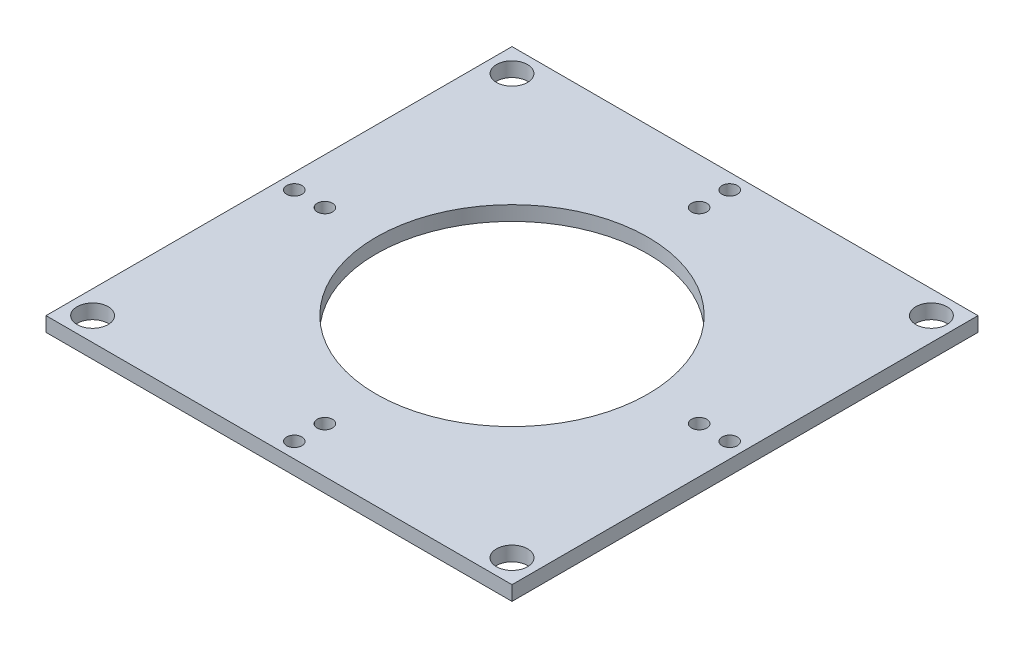
ISO-10303-21;
HEADER;
FILE_DESCRIPTION(('STEP AP214'),'2;1');
FILE_NAME('part.step','',(''),(''),'','','');
FILE_SCHEMA(('AUTOMOTIVE_DESIGN { 1 0 10303 214 1 1 1 1 }'));
ENDSEC;
DATA;
#1=APPLICATION_CONTEXT('core data for automotive mechanical design processes');
#2=APPLICATION_PROTOCOL_DEFINITION('international standard','automotive_design',2000,#1);
#3=PRODUCT_CONTEXT('',#1,'mechanical');
#4=PRODUCT('Part','Part','',(#3));
#5=PRODUCT_RELATED_PRODUCT_CATEGORY('part','',(#4));
#6=PRODUCT_DEFINITION_FORMATION('','',#4);
#7=PRODUCT_DEFINITION_CONTEXT('part definition',#1,'design');
#8=PRODUCT_DEFINITION('design','',#6,#7);
#9=PRODUCT_DEFINITION_SHAPE('','',#8);
#10=(LENGTH_UNIT() NAMED_UNIT(*) SI_UNIT(.MILLI.,.METRE.));
#11=(NAMED_UNIT(*) PLANE_ANGLE_UNIT() SI_UNIT($,.RADIAN.));
#12=(NAMED_UNIT(*) SI_UNIT($,.STERADIAN.) SOLID_ANGLE_UNIT());
#13=UNCERTAINTY_MEASURE_WITH_UNIT(LENGTH_MEASURE(1.E-05),#10,'distance_accuracy_value','');
#14=(GEOMETRIC_REPRESENTATION_CONTEXT(3) GLOBAL_UNCERTAINTY_ASSIGNED_CONTEXT((#13)) GLOBAL_UNIT_ASSIGNED_CONTEXT((#10,
#11,#12)) REPRESENTATION_CONTEXT('',''));
#15=CARTESIAN_POINT('',(0.,0.,0.));
#16=DIRECTION('',(0.,0.,1.));
#17=DIRECTION('',(1.,0.,0.));
#18=AXIS2_PLACEMENT_3D('',#15,#16,#17);
#19=CARTESIAN_POINT('',(76.2,4.7498,0.));
#20=DIRECTION('',(1.,0.,0.));
#21=DIRECTION('',(0.,0.,-1.));
#22=AXIS2_PLACEMENT_3D('',#19,#20,#21);
#23=PLANE('',#22);
#24=DIRECTION('',(0.,0.,1.));
#25=VECTOR('',#24,1.);
#26=CARTESIAN_POINT('',(76.2,0.,0.));
#27=LINE('',#26,#25);
#28=CARTESIAN_POINT('',(76.2,0.,-76.2));
#29=VERTEX_POINT('',#28);
#30=CARTESIAN_POINT('',(76.2,0.,76.2));
#31=VERTEX_POINT('',#30);
#32=EDGE_CURVE('E148',#29,#31,#27,.T.);
#33=ORIENTED_EDGE('',*,*,#32,.F.);
#34=DIRECTION('',(0.,-1.,0.));
#35=VECTOR('',#34,1.);
#36=CARTESIAN_POINT('',(76.2,4.7498,-76.2));
#37=LINE('',#36,#35);
#38=CARTESIAN_POINT('',(76.2,4.7498,-76.2));
#39=VERTEX_POINT('',#38);
#40=EDGE_CURVE('E11',#39,#29,#37,.T.);
#41=ORIENTED_EDGE('',*,*,#40,.F.);
#42=DIRECTION('',(0.,0.,1.));
#43=VECTOR('',#42,1.);
#44=CARTESIAN_POINT('',(76.2,4.7498,0.));
#45=LINE('',#44,#43);
#46=CARTESIAN_POINT('',(76.2,4.7498,76.2));
#47=VERTEX_POINT('',#46);
#48=EDGE_CURVE('E102',#39,#47,#45,.T.);
#49=ORIENTED_EDGE('',*,*,#48,.T.);
#50=DIRECTION('',(0.,-1.,0.));
#51=VECTOR('',#50,1.);
#52=CARTESIAN_POINT('',(76.2,4.7498,76.2));
#53=LINE('',#52,#51);
#54=EDGE_CURVE('E81',#47,#31,#53,.T.);
#55=ORIENTED_EDGE('',*,*,#54,.T.);
#56=EDGE_LOOP('',(#33,#41,#49,#55));
#57=FACE_BOUND('',#56,.T.);
#58=ADVANCED_FACE('F41',(#57),#23,.T.);
#59=CARTESIAN_POINT('',(0.,4.7498,-76.2));
#60=DIRECTION('',(0.,0.,-1.));
#61=DIRECTION('',(-1.,0.,0.));
#62=AXIS2_PLACEMENT_3D('',#59,#60,#61);
#63=PLANE('',#62);
#64=DIRECTION('',(1.,0.,0.));
#65=VECTOR('',#64,1.);
#66=CARTESIAN_POINT('',(0.,0.,-76.2));
#67=LINE('',#66,#65);
#68=CARTESIAN_POINT('',(-76.2,0.,-76.2));
#69=VERTEX_POINT('',#68);
#70=EDGE_CURVE('E93',#69,#29,#67,.T.);
#71=ORIENTED_EDGE('',*,*,#70,.F.);
#72=DIRECTION('',(0.,-1.,0.));
#73=VECTOR('',#72,1.);
#74=CARTESIAN_POINT('',(-76.2,4.7498,-76.2));
#75=LINE('',#74,#73);
#76=CARTESIAN_POINT('',(-76.2,4.7498,-76.2));
#77=VERTEX_POINT('',#76);
#78=EDGE_CURVE('E50',#77,#69,#75,.T.);
#79=ORIENTED_EDGE('',*,*,#78,.F.);
#80=DIRECTION('',(1.,0.,0.));
#81=VECTOR('',#80,1.);
#82=CARTESIAN_POINT('',(0.,4.7498,-76.2));
#83=LINE('',#82,#81);
#84=EDGE_CURVE('E91',#77,#39,#83,.T.);
#85=ORIENTED_EDGE('',*,*,#84,.T.);
#86=ORIENTED_EDGE('',*,*,#40,.T.);
#87=EDGE_LOOP('',(#71,#79,#85,#86));
#88=FACE_BOUND('',#87,.T.);
#89=ADVANCED_FACE('F89',(#88),#63,.T.);
#90=CARTESIAN_POINT('',(-76.1999999999999,4.7498,0.));
#91=DIRECTION('',(1.,0.,0.));
#92=DIRECTION('',(0.,0.,-1.));
#93=AXIS2_PLACEMENT_3D('',#90,#91,#92);
#94=PLANE('',#93);
#95=DIRECTION('',(0.,0.,1.));
#96=VECTOR('',#95,1.);
#97=CARTESIAN_POINT('',(-76.1999999999999,0.,0.));
#98=LINE('',#97,#96);
#99=CARTESIAN_POINT('',(-76.1999999999999,0.,76.2));
#100=VERTEX_POINT('',#99);
#101=EDGE_CURVE('E151',#69,#100,#98,.T.);
#102=ORIENTED_EDGE('',*,*,#101,.T.);
#103=DIRECTION('',(0.,-1.,0.));
#104=VECTOR('',#103,1.);
#105=CARTESIAN_POINT('',(-76.1999999999999,4.7498,76.2));
#106=LINE('',#105,#104);
#107=CARTESIAN_POINT('',(-76.1999999999999,4.7498,76.2));
#108=VERTEX_POINT('',#107);
#109=EDGE_CURVE('E96',#108,#100,#106,.T.);
#110=ORIENTED_EDGE('',*,*,#109,.F.);
#111=DIRECTION('',(0.,0.,1.));
#112=VECTOR('',#111,1.);
#113=CARTESIAN_POINT('',(-76.1999999999999,4.7498,0.));
#114=LINE('',#113,#112);
#115=EDGE_CURVE('E98',#77,#108,#114,.T.);
#116=ORIENTED_EDGE('',*,*,#115,.F.);
#117=ORIENTED_EDGE('',*,*,#78,.T.);
#118=EDGE_LOOP('',(#102,#110,#116,#117));
#119=FACE_BOUND('',#118,.T.);
#120=ADVANCED_FACE('F99',(#119),#94,.F.);
#121=CARTESIAN_POINT('',(0.,4.7498,0.));
#122=DIRECTION('',(0.,-1.,0.));
#123=DIRECTION('',(0.,0.,-1.));
#124=AXIS2_PLACEMENT_3D('',#121,#122,#123);
#125=CYLINDRICAL_SURFACE('',#124,44.45);
#126=CARTESIAN_POINT('',(0.,4.7498,0.));
#127=DIRECTION('',(0.,1.,0.));
#128=DIRECTION('',(0.,0.,1.));
#129=AXIS2_PLACEMENT_3D('',#126,#127,#128);
#130=CIRCLE('',#129,44.45);
#131=CARTESIAN_POINT('',(0.,4.7498,44.45));
#132=VERTEX_POINT('',#131);
#133=EDGE_CURVE('E104',#132,#132,#130,.T.);
#134=ORIENTED_EDGE('',*,*,#133,.T.);
#135=EDGE_LOOP('',(#134));
#136=FACE_BOUND('',#135,.T.);
#137=CARTESIAN_POINT('',(0.,0.,0.));
#138=DIRECTION('',(0.,1.,0.));
#139=DIRECTION('',(0.,0.,1.));
#140=AXIS2_PLACEMENT_3D('',#137,#138,#139);
#141=CIRCLE('',#140,44.45);
#142=CARTESIAN_POINT('',(0.,0.,44.45));
#143=VERTEX_POINT('',#142);
#144=EDGE_CURVE('E145',#143,#143,#141,.T.);
#145=ORIENTED_EDGE('',*,*,#144,.F.);
#146=EDGE_LOOP('',(#145));
#147=FACE_BOUND('',#146,.T.);
#148=ADVANCED_FACE('F167',(#136,#147),#125,.F.);
#149=CARTESIAN_POINT('',(0.,4.7498,71.2));
#150=DIRECTION('',(0.,-1.,0.));
#151=DIRECTION('',(0.,0.,-1.));
#152=AXIS2_PLACEMENT_3D('',#149,#150,#151);
#153=CYLINDRICAL_SURFACE('',#152,2.5000000000027);
#154=CARTESIAN_POINT('',(0.,4.7498,71.2));
#155=DIRECTION('',(0.,1.,0.));
#156=DIRECTION('',(0.,0.,1.));
#157=AXIS2_PLACEMENT_3D('',#154,#155,#156);
#158=CIRCLE('',#157,2.5000000000027);
#159=CARTESIAN_POINT('',(0.,4.7498,73.7000000000027));
#160=VERTEX_POINT('',#159);
#161=EDGE_CURVE('E467',#160,#160,#158,.T.);
#162=ORIENTED_EDGE('',*,*,#161,.T.);
#163=EDGE_LOOP('',(#162));
#164=FACE_BOUND('',#163,.T.);
#165=CARTESIAN_POINT('',(0.,0.,71.2));
#166=DIRECTION('',(0.,1.,0.));
#167=DIRECTION('',(0.,0.,1.));
#168=AXIS2_PLACEMENT_3D('',#165,#166,#167);
#169=CIRCLE('',#168,2.5000000000027);
#170=CARTESIAN_POINT('',(0.,0.,73.7000000000027));
#171=VERTEX_POINT('',#170);
#172=EDGE_CURVE('E142',#171,#171,#169,.T.);
#173=ORIENTED_EDGE('',*,*,#172,.F.);
#174=EDGE_LOOP('',(#173));
#175=FACE_BOUND('',#174,.T.);
#176=ADVANCED_FACE('F170',(#164,#175),#153,.F.);
#177=CARTESIAN_POINT('',(0.,4.7498,61.2));
#178=DIRECTION('',(0.,-1.,0.));
#179=DIRECTION('',(0.,0.,-1.));
#180=AXIS2_PLACEMENT_3D('',#177,#178,#179);
#181=CYLINDRICAL_SURFACE('',#180,2.5);
#182=CARTESIAN_POINT('',(0.,4.7498,61.2));
#183=DIRECTION('',(0.,1.,0.));
#184=DIRECTION('',(0.,0.,1.));
#185=AXIS2_PLACEMENT_3D('',#182,#183,#184);
#186=CIRCLE('',#185,2.5);
#187=CARTESIAN_POINT('',(0.,4.7498,63.7));
#188=VERTEX_POINT('',#187);
#189=EDGE_CURVE('E463',#188,#188,#186,.T.);
#190=ORIENTED_EDGE('',*,*,#189,.T.);
#191=EDGE_LOOP('',(#190));
#192=FACE_BOUND('',#191,.T.);
#193=CARTESIAN_POINT('',(0.,0.,61.2));
#194=DIRECTION('',(0.,1.,0.));
#195=DIRECTION('',(0.,0.,1.));
#196=AXIS2_PLACEMENT_3D('',#193,#194,#195);
#197=CIRCLE('',#196,2.5);
#198=CARTESIAN_POINT('',(0.,0.,63.7));
#199=VERTEX_POINT('',#198);
#200=EDGE_CURVE('E139',#199,#199,#197,.T.);
#201=ORIENTED_EDGE('',*,*,#200,.F.);
#202=EDGE_LOOP('',(#201));
#203=FACE_BOUND('',#202,.T.);
#204=ADVANCED_FACE('F174',(#192,#203),#181,.F.);
#205=CARTESIAN_POINT('',(-61.2,4.7498,0.));
#206=DIRECTION('',(0.,-1.,0.));
#207=DIRECTION('',(0.,0.,-1.));
#208=AXIS2_PLACEMENT_3D('',#205,#206,#207);
#209=CYLINDRICAL_SURFACE('',#208,2.5);
#210=CARTESIAN_POINT('',(-61.2,4.7498,0.));
#211=DIRECTION('',(0.,1.,0.));
#212=DIRECTION('',(0.,0.,1.));
#213=AXIS2_PLACEMENT_3D('',#210,#211,#212);
#214=CIRCLE('',#213,2.5);
#215=CARTESIAN_POINT('',(-61.2,4.7498,2.50000000000001));
#216=VERTEX_POINT('',#215);
#217=EDGE_CURVE('E459',#216,#216,#214,.T.);
#218=ORIENTED_EDGE('',*,*,#217,.T.);
#219=EDGE_LOOP('',(#218));
#220=FACE_BOUND('',#219,.T.);
#221=CARTESIAN_POINT('',(-61.2,0.,0.));
#222=DIRECTION('',(0.,1.,0.));
#223=DIRECTION('',(0.,0.,1.));
#224=AXIS2_PLACEMENT_3D('',#221,#222,#223);
#225=CIRCLE('',#224,2.5);
#226=CARTESIAN_POINT('',(-61.2,0.,2.50000000000001));
#227=VERTEX_POINT('',#226);
#228=EDGE_CURVE('E136',#227,#227,#225,.T.);
#229=ORIENTED_EDGE('',*,*,#228,.F.);
#230=EDGE_LOOP('',(#229));
#231=FACE_BOUND('',#230,.T.);
#232=ADVANCED_FACE('F178',(#220,#231),#209,.F.);
#233=CARTESIAN_POINT('',(-71.2,4.7498,0.));
#234=DIRECTION('',(0.,-1.,0.));
#235=DIRECTION('',(0.,0.,-1.));
#236=AXIS2_PLACEMENT_3D('',#233,#234,#235);
#237=CYLINDRICAL_SURFACE('',#236,2.50000000000269);
#238=CARTESIAN_POINT('',(-71.2,4.7498,0.));
#239=DIRECTION('',(0.,1.,0.));
#240=DIRECTION('',(0.,0.,1.));
#241=AXIS2_PLACEMENT_3D('',#238,#239,#240);
#242=CIRCLE('',#241,2.50000000000269);
#243=CARTESIAN_POINT('',(-71.2,4.7498,2.50000000000271));
#244=VERTEX_POINT('',#243);
#245=EDGE_CURVE('E455',#244,#244,#242,.T.);
#246=ORIENTED_EDGE('',*,*,#245,.T.);
#247=EDGE_LOOP('',(#246));
#248=FACE_BOUND('',#247,.T.);
#249=CARTESIAN_POINT('',(-71.2,0.,0.));
#250=DIRECTION('',(0.,1.,0.));
#251=DIRECTION('',(0.,0.,1.));
#252=AXIS2_PLACEMENT_3D('',#249,#250,#251);
#253=CIRCLE('',#252,2.50000000000269);
#254=CARTESIAN_POINT('',(-71.2,0.,2.50000000000271));
#255=VERTEX_POINT('',#254);
#256=EDGE_CURVE('E133',#255,#255,#253,.T.);
#257=ORIENTED_EDGE('',*,*,#256,.F.);
#258=EDGE_LOOP('',(#257));
#259=FACE_BOUND('',#258,.T.);
#260=ADVANCED_FACE('F182',(#248,#259),#237,.F.);
#261=CARTESIAN_POINT('',(0.,4.7498,-61.2));
#262=DIRECTION('',(0.,-1.,0.));
#263=DIRECTION('',(0.,0.,-1.));
#264=AXIS2_PLACEMENT_3D('',#261,#262,#263);
#265=CYLINDRICAL_SURFACE('',#264,2.5);
#266=CARTESIAN_POINT('',(0.,4.7498,-61.2));
#267=DIRECTION('',(0.,1.,0.));
#268=DIRECTION('',(0.,0.,1.));
#269=AXIS2_PLACEMENT_3D('',#266,#267,#268);
#270=CIRCLE('',#269,2.5);
#271=CARTESIAN_POINT('',(0.,4.7498,-58.7));
#272=VERTEX_POINT('',#271);
#273=EDGE_CURVE('E451',#272,#272,#270,.T.);
#274=ORIENTED_EDGE('',*,*,#273,.T.);
#275=EDGE_LOOP('',(#274));
#276=FACE_BOUND('',#275,.T.);
#277=CARTESIAN_POINT('',(0.,0.,-61.2));
#278=DIRECTION('',(0.,1.,0.));
#279=DIRECTION('',(0.,0.,1.));
#280=AXIS2_PLACEMENT_3D('',#277,#278,#279);
#281=CIRCLE('',#280,2.5);
#282=CARTESIAN_POINT('',(0.,0.,-58.7));
#283=VERTEX_POINT('',#282);
#284=EDGE_CURVE('E130',#283,#283,#281,.T.);
#285=ORIENTED_EDGE('',*,*,#284,.F.);
#286=EDGE_LOOP('',(#285));
#287=FACE_BOUND('',#286,.T.);
#288=ADVANCED_FACE('F186',(#276,#287),#265,.F.);
#289=CARTESIAN_POINT('',(0.,4.7498,-71.2));
#290=DIRECTION('',(0.,-1.,0.));
#291=DIRECTION('',(0.,0.,-1.));
#292=AXIS2_PLACEMENT_3D('',#289,#290,#291);
#293=CYLINDRICAL_SURFACE('',#292,2.5000000000027);
#294=CARTESIAN_POINT('',(0.,4.7498,-71.2));
#295=DIRECTION('',(0.,1.,0.));
#296=DIRECTION('',(0.,0.,1.));
#297=AXIS2_PLACEMENT_3D('',#294,#295,#296);
#298=CIRCLE('',#297,2.5000000000027);
#299=CARTESIAN_POINT('',(0.,4.7498,-68.6999999999973));
#300=VERTEX_POINT('',#299);
#301=EDGE_CURVE('E447',#300,#300,#298,.T.);
#302=ORIENTED_EDGE('',*,*,#301,.T.);
#303=EDGE_LOOP('',(#302));
#304=FACE_BOUND('',#303,.T.);
#305=CARTESIAN_POINT('',(0.,0.,-71.2));
#306=DIRECTION('',(0.,1.,0.));
#307=DIRECTION('',(0.,0.,1.));
#308=AXIS2_PLACEMENT_3D('',#305,#306,#307);
#309=CIRCLE('',#308,2.5000000000027);
#310=CARTESIAN_POINT('',(0.,0.,-68.6999999999973));
#311=VERTEX_POINT('',#310);
#312=EDGE_CURVE('E127',#311,#311,#309,.T.);
#313=ORIENTED_EDGE('',*,*,#312,.F.);
#314=EDGE_LOOP('',(#313));
#315=FACE_BOUND('',#314,.T.);
#316=ADVANCED_FACE('F190',(#304,#315),#293,.F.);
#317=CARTESIAN_POINT('',(61.2,4.7498,0.));
#318=DIRECTION('',(0.,-1.,0.));
#319=DIRECTION('',(0.,0.,-1.));
#320=AXIS2_PLACEMENT_3D('',#317,#318,#319);
#321=CYLINDRICAL_SURFACE('',#320,2.5);
#322=CARTESIAN_POINT('',(61.2,4.7498,0.));
#323=DIRECTION('',(0.,1.,0.));
#324=DIRECTION('',(0.,0.,1.));
#325=AXIS2_PLACEMENT_3D('',#322,#323,#324);
#326=CIRCLE('',#325,2.5);
#327=CARTESIAN_POINT('',(61.2,4.7498,2.5));
#328=VERTEX_POINT('',#327);
#329=EDGE_CURVE('E443',#328,#328,#326,.T.);
#330=ORIENTED_EDGE('',*,*,#329,.T.);
#331=EDGE_LOOP('',(#330));
#332=FACE_BOUND('',#331,.T.);
#333=CARTESIAN_POINT('',(61.2,0.,0.));
#334=DIRECTION('',(0.,1.,0.));
#335=DIRECTION('',(0.,0.,1.));
#336=AXIS2_PLACEMENT_3D('',#333,#334,#335);
#337=CIRCLE('',#336,2.5);
#338=CARTESIAN_POINT('',(61.2,0.,2.5));
#339=VERTEX_POINT('',#338);
#340=EDGE_CURVE('E124',#339,#339,#337,.T.);
#341=ORIENTED_EDGE('',*,*,#340,.F.);
#342=EDGE_LOOP('',(#341));
#343=FACE_BOUND('',#342,.T.);
#344=ADVANCED_FACE('F194',(#332,#343),#321,.F.);
#345=CARTESIAN_POINT('',(71.2,4.7498,0.));
#346=DIRECTION('',(0.,-1.,0.));
#347=DIRECTION('',(0.,0.,-1.));
#348=AXIS2_PLACEMENT_3D('',#345,#346,#347);
#349=CYLINDRICAL_SURFACE('',#348,2.50000000000269);
#350=CARTESIAN_POINT('',(71.2,4.7498,0.));
#351=DIRECTION('',(0.,1.,0.));
#352=DIRECTION('',(0.,0.,1.));
#353=AXIS2_PLACEMENT_3D('',#350,#351,#352);
#354=CIRCLE('',#353,2.50000000000269);
#355=CARTESIAN_POINT('',(71.2,4.7498,2.50000000000269));
#356=VERTEX_POINT('',#355);
#357=EDGE_CURVE('E439',#356,#356,#354,.T.);
#358=ORIENTED_EDGE('',*,*,#357,.T.);
#359=EDGE_LOOP('',(#358));
#360=FACE_BOUND('',#359,.T.);
#361=CARTESIAN_POINT('',(71.2,0.,0.));
#362=DIRECTION('',(0.,1.,0.));
#363=DIRECTION('',(0.,0.,1.));
#364=AXIS2_PLACEMENT_3D('',#361,#362,#363);
#365=CIRCLE('',#364,2.50000000000269);
#366=CARTESIAN_POINT('',(71.2,0.,2.50000000000269));
#367=VERTEX_POINT('',#366);
#368=EDGE_CURVE('E121',#367,#367,#365,.T.);
#369=ORIENTED_EDGE('',*,*,#368,.F.);
#370=EDGE_LOOP('',(#369));
#371=FACE_BOUND('',#370,.T.);
#372=ADVANCED_FACE('F198',(#360,#371),#349,.F.);
#373=CARTESIAN_POINT('',(-68.58,4.7498,68.58));
#374=DIRECTION('',(0.,-1.,0.));
#375=DIRECTION('',(0.,0.,-1.));
#376=AXIS2_PLACEMENT_3D('',#373,#374,#375);
#377=CYLINDRICAL_SURFACE('',#376,5.08000000000001);
#378=CARTESIAN_POINT('',(-68.58,4.7498,68.58));
#379=DIRECTION('',(0.,1.,0.));
#380=DIRECTION('',(0.,0.,1.));
#381=AXIS2_PLACEMENT_3D('',#378,#379,#380);
#382=CIRCLE('',#381,5.08000000000001);
#383=CARTESIAN_POINT('',(-68.58,4.7498,73.66));
#384=VERTEX_POINT('',#383);
#385=EDGE_CURVE('E435',#384,#384,#382,.T.);
#386=ORIENTED_EDGE('',*,*,#385,.T.);
#387=EDGE_LOOP('',(#386));
#388=FACE_BOUND('',#387,.T.);
#389=CARTESIAN_POINT('',(-68.58,0.,68.58));
#390=DIRECTION('',(0.,1.,0.));
#391=DIRECTION('',(0.,0.,1.));
#392=AXIS2_PLACEMENT_3D('',#389,#390,#391);
#393=CIRCLE('',#392,5.08000000000001);
#394=CARTESIAN_POINT('',(-68.58,0.,73.66));
#395=VERTEX_POINT('',#394);
#396=EDGE_CURVE('E118',#395,#395,#393,.T.);
#397=ORIENTED_EDGE('',*,*,#396,.F.);
#398=EDGE_LOOP('',(#397));
#399=FACE_BOUND('',#398,.T.);
#400=ADVANCED_FACE('F202',(#388,#399),#377,.F.);
#401=CARTESIAN_POINT('',(-68.58,4.7498,-68.58));
#402=DIRECTION('',(0.,-1.,0.));
#403=DIRECTION('',(0.,0.,-1.));
#404=AXIS2_PLACEMENT_3D('',#401,#402,#403);
#405=CYLINDRICAL_SURFACE('',#404,5.08000000000001);
#406=CARTESIAN_POINT('',(-68.58,4.7498,-68.58));
#407=DIRECTION('',(0.,1.,0.));
#408=DIRECTION('',(0.,0.,1.));
#409=AXIS2_PLACEMENT_3D('',#406,#407,#408);
#410=CIRCLE('',#409,5.08000000000001);
#411=CARTESIAN_POINT('',(-68.58,4.7498,-63.5));
#412=VERTEX_POINT('',#411);
#413=EDGE_CURVE('E431',#412,#412,#410,.T.);
#414=ORIENTED_EDGE('',*,*,#413,.T.);
#415=EDGE_LOOP('',(#414));
#416=FACE_BOUND('',#415,.T.);
#417=CARTESIAN_POINT('',(-68.58,0.,-68.58));
#418=DIRECTION('',(0.,1.,0.));
#419=DIRECTION('',(0.,0.,1.));
#420=AXIS2_PLACEMENT_3D('',#417,#418,#419);
#421=CIRCLE('',#420,5.08000000000001);
#422=CARTESIAN_POINT('',(-68.58,0.,-63.5));
#423=VERTEX_POINT('',#422);
#424=EDGE_CURVE('E115',#423,#423,#421,.T.);
#425=ORIENTED_EDGE('',*,*,#424,.F.);
#426=EDGE_LOOP('',(#425));
#427=FACE_BOUND('',#426,.T.);
#428=ADVANCED_FACE('F206',(#416,#427),#405,.F.);
#429=CARTESIAN_POINT('',(68.58,4.7498,-68.58));
#430=DIRECTION('',(0.,-1.,0.));
#431=DIRECTION('',(0.,0.,-1.));
#432=AXIS2_PLACEMENT_3D('',#429,#430,#431);
#433=CYLINDRICAL_SURFACE('',#432,5.08000000000001);
#434=CARTESIAN_POINT('',(68.58,4.7498,-68.58));
#435=DIRECTION('',(0.,1.,0.));
#436=DIRECTION('',(0.,0.,1.));
#437=AXIS2_PLACEMENT_3D('',#434,#435,#436);
#438=CIRCLE('',#437,5.08000000000001);
#439=CARTESIAN_POINT('',(68.58,4.7498,-63.5));
#440=VERTEX_POINT('',#439);
#441=EDGE_CURVE('E220',#440,#440,#438,.T.);
#442=ORIENTED_EDGE('',*,*,#441,.T.);
#443=EDGE_LOOP('',(#442));
#444=FACE_BOUND('',#443,.T.);
#445=CARTESIAN_POINT('',(68.58,0.,-68.58));
#446=DIRECTION('',(0.,1.,0.));
#447=DIRECTION('',(0.,0.,1.));
#448=AXIS2_PLACEMENT_3D('',#445,#446,#447);
#449=CIRCLE('',#448,5.08000000000001);
#450=CARTESIAN_POINT('',(68.58,0.,-63.5));
#451=VERTEX_POINT('',#450);
#452=EDGE_CURVE('E112',#451,#451,#449,.T.);
#453=ORIENTED_EDGE('',*,*,#452,.F.);
#454=EDGE_LOOP('',(#453));
#455=FACE_BOUND('',#454,.T.);
#456=ADVANCED_FACE('F209',(#444,#455),#433,.F.);
#457=CARTESIAN_POINT('',(68.58,4.7498,68.58));
#458=DIRECTION('',(0.,-1.,0.));
#459=DIRECTION('',(0.,0.,-1.));
#460=AXIS2_PLACEMENT_3D('',#457,#458,#459);
#461=CYLINDRICAL_SURFACE('',#460,5.08000000000001);
#462=CARTESIAN_POINT('',(68.58,4.7498,68.58));
#463=DIRECTION('',(0.,1.,0.));
#464=DIRECTION('',(0.,0.,1.));
#465=AXIS2_PLACEMENT_3D('',#462,#463,#464);
#466=CIRCLE('',#465,5.08000000000001);
#467=CARTESIAN_POINT('',(68.58,4.7498,73.66));
#468=VERTEX_POINT('',#467);
#469=EDGE_CURVE('E154',#468,#468,#466,.T.);
#470=ORIENTED_EDGE('',*,*,#469,.T.);
#471=EDGE_LOOP('',(#470));
#472=FACE_BOUND('',#471,.T.);
#473=CARTESIAN_POINT('',(68.58,0.,68.58));
#474=DIRECTION('',(0.,1.,0.));
#475=DIRECTION('',(0.,0.,1.));
#476=AXIS2_PLACEMENT_3D('',#473,#474,#475);
#477=CIRCLE('',#476,5.08000000000001);
#478=CARTESIAN_POINT('',(68.58,0.,73.66));
#479=VERTEX_POINT('',#478);
#480=EDGE_CURVE('E109',#479,#479,#477,.T.);
#481=ORIENTED_EDGE('',*,*,#480,.F.);
#482=EDGE_LOOP('',(#481));
#483=FACE_BOUND('',#482,.T.);
#484=ADVANCED_FACE('F43',(#472,#483),#461,.F.);
#485=CARTESIAN_POINT('',(0.,4.7498,76.2));
#486=DIRECTION('',(0.,0.,-1.));
#487=DIRECTION('',(-1.,0.,0.));
#488=AXIS2_PLACEMENT_3D('',#485,#486,#487);
#489=PLANE('',#488);
#490=DIRECTION('',(1.,0.,0.));
#491=VECTOR('',#490,1.);
#492=CARTESIAN_POINT('',(0.,0.,76.2));
#493=LINE('',#492,#491);
#494=EDGE_CURVE('E74',#100,#31,#493,.T.);
#495=ORIENTED_EDGE('',*,*,#494,.T.);
#496=ORIENTED_EDGE('',*,*,#54,.F.);
#497=DIRECTION('',(1.,0.,0.));
#498=VECTOR('',#497,1.);
#499=CARTESIAN_POINT('',(0.,4.7498,76.2));
#500=LINE('',#499,#498);
#501=EDGE_CURVE('E58',#108,#47,#500,.T.);
#502=ORIENTED_EDGE('',*,*,#501,.F.);
#503=ORIENTED_EDGE('',*,*,#109,.T.);
#504=EDGE_LOOP('',(#495,#496,#502,#503));
#505=FACE_BOUND('',#504,.T.);
#506=ADVANCED_FACE('F157',(#505),#489,.F.);
#507=CARTESIAN_POINT('',(0.,4.7498,0.));
#508=DIRECTION('',(0.,1.,0.));
#509=DIRECTION('',(0.,0.,1.));
#510=AXIS2_PLACEMENT_3D('',#507,#508,#509);
#511=PLANE('',#510);
#512=ORIENTED_EDGE('',*,*,#469,.F.);
#513=EDGE_LOOP('',(#512));
#514=FACE_BOUND('',#513,.T.);
#515=ORIENTED_EDGE('',*,*,#441,.F.);
#516=EDGE_LOOP('',(#515));
#517=FACE_BOUND('',#516,.T.);
#518=ORIENTED_EDGE('',*,*,#413,.F.);
#519=EDGE_LOOP('',(#518));
#520=FACE_BOUND('',#519,.T.);
#521=ORIENTED_EDGE('',*,*,#385,.F.);
#522=EDGE_LOOP('',(#521));
#523=FACE_BOUND('',#522,.T.);
#524=ORIENTED_EDGE('',*,*,#357,.F.);
#525=EDGE_LOOP('',(#524));
#526=FACE_BOUND('',#525,.T.);
#527=ORIENTED_EDGE('',*,*,#329,.F.);
#528=EDGE_LOOP('',(#527));
#529=FACE_BOUND('',#528,.T.);
#530=ORIENTED_EDGE('',*,*,#301,.F.);
#531=EDGE_LOOP('',(#530));
#532=FACE_BOUND('',#531,.T.);
#533=ORIENTED_EDGE('',*,*,#273,.F.);
#534=EDGE_LOOP('',(#533));
#535=FACE_BOUND('',#534,.T.);
#536=ORIENTED_EDGE('',*,*,#245,.F.);
#537=EDGE_LOOP('',(#536));
#538=FACE_BOUND('',#537,.T.);
#539=ORIENTED_EDGE('',*,*,#217,.F.);
#540=EDGE_LOOP('',(#539));
#541=FACE_BOUND('',#540,.T.);
#542=ORIENTED_EDGE('',*,*,#189,.F.);
#543=EDGE_LOOP('',(#542));
#544=FACE_BOUND('',#543,.T.);
#545=ORIENTED_EDGE('',*,*,#161,.F.);
#546=EDGE_LOOP('',(#545));
#547=FACE_BOUND('',#546,.T.);
#548=ORIENTED_EDGE('',*,*,#133,.F.);
#549=EDGE_LOOP('',(#548));
#550=FACE_BOUND('',#549,.T.);
#551=ORIENTED_EDGE('',*,*,#48,.F.);
#552=ORIENTED_EDGE('',*,*,#84,.F.);
#553=ORIENTED_EDGE('',*,*,#115,.T.);
#554=ORIENTED_EDGE('',*,*,#501,.T.);
#555=EDGE_LOOP('',(#551,#552,#553,#554));
#556=FACE_BOUND('',#555,.T.);
#557=ADVANCED_FACE('F101',(#514,#517,#520,#523,#526,#529,#532,#535,#538,#541,#544,#547,#550,
#556),#511,.T.);
#558=CARTESIAN_POINT('',(0.,0.,0.));
#559=DIRECTION('',(0.,1.,0.));
#560=DIRECTION('',(0.,0.,1.));
#561=AXIS2_PLACEMENT_3D('',#558,#559,#560);
#562=PLANE('',#561);
#563=ORIENTED_EDGE('',*,*,#480,.T.);
#564=EDGE_LOOP('',(#563));
#565=FACE_BOUND('',#564,.T.);
#566=ORIENTED_EDGE('',*,*,#452,.T.);
#567=EDGE_LOOP('',(#566));
#568=FACE_BOUND('',#567,.T.);
#569=ORIENTED_EDGE('',*,*,#424,.T.);
#570=EDGE_LOOP('',(#569));
#571=FACE_BOUND('',#570,.T.);
#572=ORIENTED_EDGE('',*,*,#396,.T.);
#573=EDGE_LOOP('',(#572));
#574=FACE_BOUND('',#573,.T.);
#575=ORIENTED_EDGE('',*,*,#368,.T.);
#576=EDGE_LOOP('',(#575));
#577=FACE_BOUND('',#576,.T.);
#578=ORIENTED_EDGE('',*,*,#340,.T.);
#579=EDGE_LOOP('',(#578));
#580=FACE_BOUND('',#579,.T.);
#581=ORIENTED_EDGE('',*,*,#312,.T.);
#582=EDGE_LOOP('',(#581));
#583=FACE_BOUND('',#582,.T.);
#584=ORIENTED_EDGE('',*,*,#284,.T.);
#585=EDGE_LOOP('',(#584));
#586=FACE_BOUND('',#585,.T.);
#587=ORIENTED_EDGE('',*,*,#256,.T.);
#588=EDGE_LOOP('',(#587));
#589=FACE_BOUND('',#588,.T.);
#590=ORIENTED_EDGE('',*,*,#228,.T.);
#591=EDGE_LOOP('',(#590));
#592=FACE_BOUND('',#591,.T.);
#593=ORIENTED_EDGE('',*,*,#200,.T.);
#594=EDGE_LOOP('',(#593));
#595=FACE_BOUND('',#594,.T.);
#596=ORIENTED_EDGE('',*,*,#172,.T.);
#597=EDGE_LOOP('',(#596));
#598=FACE_BOUND('',#597,.T.);
#599=ORIENTED_EDGE('',*,*,#144,.T.);
#600=EDGE_LOOP('',(#599));
#601=FACE_BOUND('',#600,.T.);
#602=ORIENTED_EDGE('',*,*,#32,.T.);
#603=ORIENTED_EDGE('',*,*,#494,.F.);
#604=ORIENTED_EDGE('',*,*,#101,.F.);
#605=ORIENTED_EDGE('',*,*,#70,.T.);
#606=EDGE_LOOP('',(#602,#603,#604,#605));
#607=FACE_BOUND('',#606,.T.);
#608=ADVANCED_FACE('F158',(#565,#568,#571,#574,#577,#580,#583,#586,#589,#592,#595,#598,#601,
#607),#562,.F.);
#609=CLOSED_SHELL('',(#58,#89,#120,#148,#176,#204,#232,#260,#288,#316,#344,#372,#400,#428,#456,
#484,#506,#557,#608));
#610=MANIFOLD_SOLID_BREP('B2',#609);
#611=ADVANCED_BREP_SHAPE_REPRESENTATION('',(#18,#610),#14);
#612=SHAPE_DEFINITION_REPRESENTATION(#9,#611);
ENDSEC;
END-ISO-10303-21;
